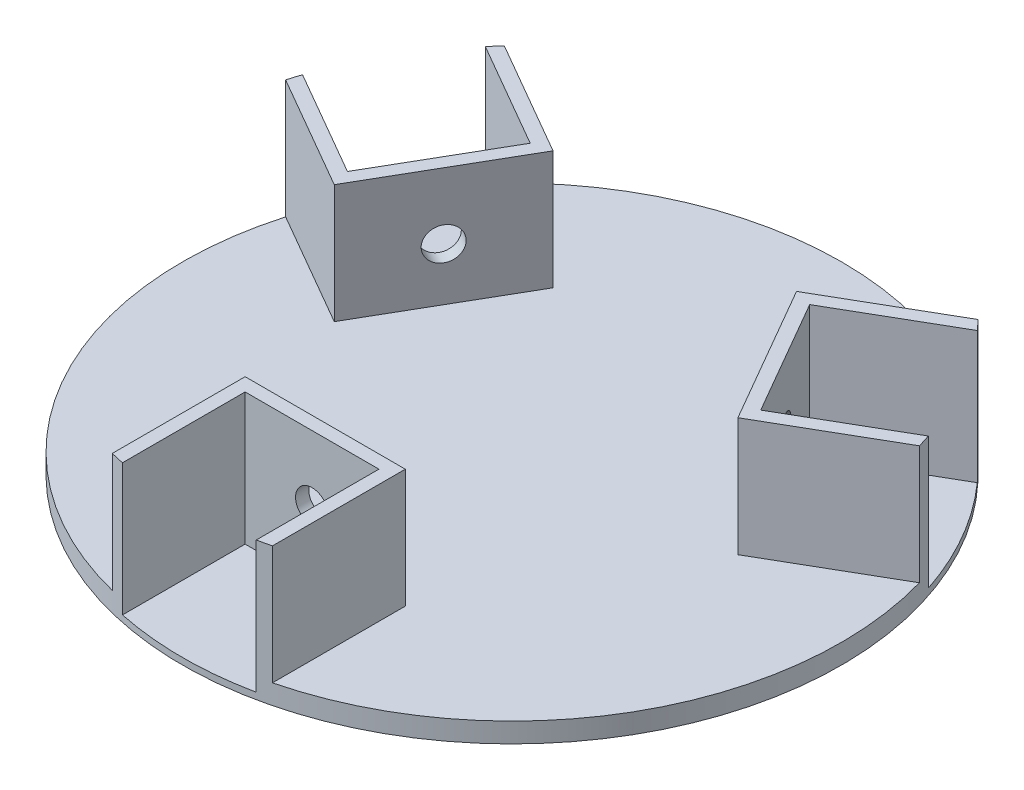
ISO-10303-21;
HEADER;
FILE_DESCRIPTION(('STEP AP214'),'2;1');
FILE_NAME('part.step','',(''),(''),'','','');
FILE_SCHEMA(('AUTOMOTIVE_DESIGN { 1 0 10303 214 1 1 1 1 }'));
ENDSEC;
DATA;
#1=APPLICATION_CONTEXT('core data for automotive mechanical design processes');
#2=APPLICATION_PROTOCOL_DEFINITION('international standard','automotive_design',2000,#1);
#3=PRODUCT_CONTEXT('',#1,'mechanical');
#4=PRODUCT('Part','Part','',(#3));
#5=PRODUCT_RELATED_PRODUCT_CATEGORY('part','',(#4));
#6=PRODUCT_DEFINITION_FORMATION('','',#4);
#7=PRODUCT_DEFINITION_CONTEXT('part definition',#1,'design');
#8=PRODUCT_DEFINITION('design','',#6,#7);
#9=PRODUCT_DEFINITION_SHAPE('','',#8);
#10=(LENGTH_UNIT() NAMED_UNIT(*) SI_UNIT(.MILLI.,.METRE.));
#11=(NAMED_UNIT(*) PLANE_ANGLE_UNIT() SI_UNIT($,.RADIAN.));
#12=(NAMED_UNIT(*) SI_UNIT($,.STERADIAN.) SOLID_ANGLE_UNIT());
#13=UNCERTAINTY_MEASURE_WITH_UNIT(LENGTH_MEASURE(1.E-05),#10,'distance_accuracy_value','');
#14=(GEOMETRIC_REPRESENTATION_CONTEXT(3) GLOBAL_UNCERTAINTY_ASSIGNED_CONTEXT((#13)) GLOBAL_UNIT_ASSIGNED_CONTEXT((#10,
#11,#12)) REPRESENTATION_CONTEXT('',''));
#15=CARTESIAN_POINT('',(0.,0.,0.));
#16=DIRECTION('',(0.,0.,1.));
#17=DIRECTION('',(1.,0.,0.));
#18=AXIS2_PLACEMENT_3D('',#15,#16,#17);
#19=CARTESIAN_POINT('',(0.,20.,240.726435625391));
#20=DIRECTION('',(0.,1.,0.));
#21=DIRECTION('',(0.,0.,1.));
#22=AXIS2_PLACEMENT_3D('',#19,#20,#21);
#23=PLANE('',#22);
#24=DIRECTION('',(0.,0.,-1.));
#25=VECTOR('',#24,1.);
#26=CARTESIAN_POINT('',(-12.1499999999999,20.,271.07041555162));
#27=LINE('',#26,#25);
#28=CARTESIAN_POINT('',(-12.15,20.,289.22775004057));
#29=VERTEX_POINT('',#28);
#30=CARTESIAN_POINT('',(-12.1499999999999,20.,269.07041555162));
#31=VERTEX_POINT('',#30);
#32=EDGE_CURVE('E291',#29,#31,#27,.T.);
#33=ORIENTED_EDGE('',*,*,#32,.F.);
#34=CARTESIAN_POINT('',(0.,20.,240.726435625391));
#35=DIRECTION('',(0.,1.,0.));
#36=DIRECTION('',(0.,0.,1.));
#37=AXIS2_PLACEMENT_3D('',#34,#35,#36);
#38=CIRCLE('',#37,50.);
#39=CARTESIAN_POINT('',(-10.15,20.,289.685372501104));
#40=VERTEX_POINT('',#39);
#41=EDGE_CURVE('E218',#29,#40,#38,.T.);
#42=ORIENTED_EDGE('',*,*,#41,.T.);
#43=DIRECTION('',(0.,0.,-1.));
#44=VECTOR('',#43,1.);
#45=CARTESIAN_POINT('',(-10.1499999999999,20.,271.07041555162));
#46=LINE('',#45,#44);
#47=CARTESIAN_POINT('',(-10.1499999999999,20.,271.07041555162));
#48=VERTEX_POINT('',#47);
#49=EDGE_CURVE('E211',#40,#48,#46,.T.);
#50=ORIENTED_EDGE('',*,*,#49,.T.);
#51=DIRECTION('',(1.,0.,0.));
#52=VECTOR('',#51,1.);
#53=CARTESIAN_POINT('',(10.15,20.,271.07041555162));
#54=LINE('',#53,#52);
#55=CARTESIAN_POINT('',(10.15,20.,271.07041555162));
#56=VERTEX_POINT('',#55);
#57=EDGE_CURVE('E328',#48,#56,#54,.T.);
#58=ORIENTED_EDGE('',*,*,#57,.T.);
#59=DIRECTION('',(0.,0.,1.));
#60=VECTOR('',#59,1.);
#61=CARTESIAN_POINT('',(10.15,20.,271.07041555162));
#62=LINE('',#61,#60);
#63=CARTESIAN_POINT('',(10.1500000000001,20.,289.685372501104));
#64=VERTEX_POINT('',#63);
#65=EDGE_CURVE('E330',#56,#64,#62,.T.);
#66=ORIENTED_EDGE('',*,*,#65,.T.);
#67=CARTESIAN_POINT('',(0.,20.,240.726435625391));
#68=DIRECTION('',(0.,1.,0.));
#69=DIRECTION('',(0.,0.,1.));
#70=AXIS2_PLACEMENT_3D('',#67,#68,#69);
#71=CIRCLE('',#70,50.);
#72=CARTESIAN_POINT('',(12.15,20.,289.22775004057));
#73=VERTEX_POINT('',#72);
#74=EDGE_CURVE('E333',#64,#73,#71,.T.);
#75=ORIENTED_EDGE('',*,*,#74,.T.);
#76=DIRECTION('',(0.,0.,1.));
#77=VECTOR('',#76,1.);
#78=CARTESIAN_POINT('',(12.15,20.,271.07041555162));
#79=LINE('',#78,#77);
#80=CARTESIAN_POINT('',(12.15,20.,269.07041555162));
#81=VERTEX_POINT('',#80);
#82=EDGE_CURVE('E297',#81,#73,#79,.T.);
#83=ORIENTED_EDGE('',*,*,#82,.F.);
#84=DIRECTION('',(1.,0.,0.));
#85=VECTOR('',#84,1.);
#86=CARTESIAN_POINT('',(10.15,20.,269.07041555162));
#87=LINE('',#86,#85);
#88=EDGE_CURVE('E294',#31,#81,#87,.T.);
#89=ORIENTED_EDGE('',*,*,#88,.F.);
#90=EDGE_LOOP('',(#33,#42,#50,#58,#66,#75,#83,#89));
#91=FACE_BOUND('',#90,.T.);
#92=ADVANCED_FACE('F33',(#91),#23,.T.);
#93=DIRECTION('',(-0.866025403784439,0.,0.499999999999999));
#94=VECTOR('',#93,1.);
#95=CARTESIAN_POINT('',(32.3536574680391,20.,236.076654318258));
#96=LINE('',#95,#94);
#97=CARTESIAN_POINT('',(48.0783704004809,20.,226.997987073783));
#98=VERTEX_POINT('',#97);
#99=CARTESIAN_POINT('',(30.6216066604702,20.,237.076654318258));
#100=VERTEX_POINT('',#99);
#101=EDGE_CURVE('E300',#98,#100,#96,.T.);
#102=ORIENTED_EDGE('',*,*,#101,.F.);
#103=CARTESIAN_POINT('',(47.4746830766457,20.,225.037125035947));
#104=VERTEX_POINT('',#103);
#105=EDGE_CURVE('E332',#98,#104,#71,.T.);
#106=ORIENTED_EDGE('',*,*,#105,.T.);
#107=DIRECTION('',(-0.866025403784439,0.,0.499999999999999));
#108=VECTOR('',#107,1.);
#109=CARTESIAN_POINT('',(31.3536574680391,20.,234.344603510689));
#110=LINE('',#109,#108);
#111=CARTESIAN_POINT('',(31.3536574680391,20.,234.344603510689));
#112=VERTEX_POINT('',#111);
#113=EDGE_CURVE('E336',#104,#112,#110,.T.);
#114=ORIENTED_EDGE('',*,*,#113,.T.);
#115=DIRECTION('',(-0.500000000000001,0.,-0.866025403784438));
#116=VECTOR('',#115,1.);
#117=CARTESIAN_POINT('',(21.2036574680391,20.,216.764287813865));
#118=LINE('',#117,#116);
#119=CARTESIAN_POINT('',(21.2036574680391,20.,216.764287813865));
#120=VERTEX_POINT('',#119);
#121=EDGE_CURVE('E338',#112,#120,#118,.T.);
#122=ORIENTED_EDGE('',*,*,#121,.T.);
#123=DIRECTION('',(0.866025403784437,0.,-0.500000000000003));
#124=VECTOR('',#123,1.);
#125=CARTESIAN_POINT('',(21.2036574680391,20.,216.764287813865));
#126=LINE('',#125,#124);
#127=CARTESIAN_POINT('',(37.3246830766457,20.,207.456809339123));
#128=VERTEX_POINT('',#127);
#129=EDGE_CURVE('E129',#120,#128,#126,.T.);
#130=ORIENTED_EDGE('',*,*,#129,.T.);
#131=CARTESIAN_POINT('',(0.,20.,240.726435625391));
#132=DIRECTION('',(0.,1.,0.));
#133=DIRECTION('',(0.,0.,1.));
#134=AXIS2_PLACEMENT_3D('',#131,#132,#133);
#135=CIRCLE('',#134,50.);
#136=CARTESIAN_POINT('',(35.9283704004809,20.,205.953569761821));
#137=VERTEX_POINT('',#136);
#138=EDGE_CURVE('E128',#128,#137,#135,.T.);
#139=ORIENTED_EDGE('',*,*,#138,.T.);
#140=DIRECTION('',(0.866025403784437,0.,-0.500000000000002));
#141=VECTOR('',#140,1.);
#142=CARTESIAN_POINT('',(20.2036574680391,20.,215.032237006296));
#143=LINE('',#142,#141);
#144=CARTESIAN_POINT('',(18.4716066604702,20.,216.032237006296));
#145=VERTEX_POINT('',#144);
#146=EDGE_CURVE('E312',#145,#137,#143,.T.);
#147=ORIENTED_EDGE('',*,*,#146,.F.);
#148=DIRECTION('',(-0.500000000000001,0.,-0.866025403784438));
#149=VECTOR('',#148,1.);
#150=CARTESIAN_POINT('',(19.4716066604702,20.,217.764287813865));
#151=LINE('',#150,#149);
#152=EDGE_CURVE('E309',#100,#145,#151,.T.);
#153=ORIENTED_EDGE('',*,*,#152,.F.);
#154=EDGE_LOOP('',(#102,#106,#114,#122,#130,#139,#147,#153));
#155=FACE_BOUND('',#154,.T.);
#156=ADVANCED_FACE('F343',(#155),#23,.T.);
#157=CARTESIAN_POINT('',(-31.353657468039,20.,234.344603510689));
#158=DIRECTION('',(-0.499999999999998,0.,0.86602540378444));
#159=DIRECTION('',(0.86602540378444,0.,0.499999999999998));
#160=AXIS2_PLACEMENT_3D('',#157,#158,#159);
#161=PLANE('',#160);
#162=DIRECTION('',(-0.86602540378444,0.,-0.499999999999998));
#163=VECTOR('',#162,1.);
#164=CARTESIAN_POINT('',(-31.353657468039,0.,234.344603510689));
#165=LINE('',#164,#163);
#166=CARTESIAN_POINT('',(-31.353657468039,0.,234.344603510689));
#167=VERTEX_POINT('',#166);
#168=CARTESIAN_POINT('',(-47.4746830766456,0.,225.037125035947));
#169=VERTEX_POINT('',#168);
#170=EDGE_CURVE('E156',#167,#169,#165,.T.);
#171=ORIENTED_EDGE('',*,*,#170,.T.);
#172=DIRECTION('',(0.,-1.,0.));
#173=VECTOR('',#172,1.);
#174=CARTESIAN_POINT('',(-47.4746830766457,20.,225.037125035947));
#175=LINE('',#174,#173);
#176=CARTESIAN_POINT('',(-47.4746830766457,20.,225.037125035947));
#177=VERTEX_POINT('',#176);
#178=EDGE_CURVE('E11',#177,#169,#175,.T.);
#179=ORIENTED_EDGE('',*,*,#178,.F.);
#180=DIRECTION('',(-0.86602540378444,0.,-0.499999999999998));
#181=VECTOR('',#180,1.);
#182=CARTESIAN_POINT('',(-31.353657468039,20.,234.344603510689));
#183=LINE('',#182,#181);
#184=CARTESIAN_POINT('',(-31.353657468039,20.,234.344603510689));
#185=VERTEX_POINT('',#184);
#186=EDGE_CURVE('E181',#185,#177,#183,.T.);
#187=ORIENTED_EDGE('',*,*,#186,.F.);
#188=DIRECTION('',(0.,-1.,0.));
#189=VECTOR('',#188,1.);
#190=CARTESIAN_POINT('',(-31.353657468039,20.,234.344603510689));
#191=LINE('',#190,#189);
#192=EDGE_CURVE('E147',#185,#167,#191,.T.);
#193=ORIENTED_EDGE('',*,*,#192,.T.);
#194=EDGE_LOOP('',(#171,#179,#187,#193));
#195=FACE_BOUND('',#194,.T.);
#196=ADVANCED_FACE('F35',(#195),#161,.F.);
#197=CARTESIAN_POINT('',(-10.1499999999999,20.,271.07041555162));
#198=DIRECTION('',(-1.,0.,0.));
#199=DIRECTION('',(0.,0.,1.));
#200=AXIS2_PLACEMENT_3D('',#197,#198,#199);
#201=PLANE('',#200);
#202=DIRECTION('',(0.,0.,-1.));
#203=VECTOR('',#202,1.);
#204=CARTESIAN_POINT('',(-10.1499999999999,0.,271.07041555162));
#205=LINE('',#204,#203);
#206=CARTESIAN_POINT('',(-10.15,0.,289.685372501104));
#207=VERTEX_POINT('',#206);
#208=CARTESIAN_POINT('',(-10.1499999999999,0.,271.07041555162));
#209=VERTEX_POINT('',#208);
#210=EDGE_CURVE('E160',#207,#209,#205,.T.);
#211=ORIENTED_EDGE('',*,*,#210,.T.);
#212=DIRECTION('',(0.,-1.,0.));
#213=VECTOR('',#212,1.);
#214=CARTESIAN_POINT('',(-10.1499999999999,20.,271.07041555162));
#215=LINE('',#214,#213);
#216=EDGE_CURVE('E195',#48,#209,#215,.T.);
#217=ORIENTED_EDGE('',*,*,#216,.F.);
#218=ORIENTED_EDGE('',*,*,#49,.F.);
#219=DIRECTION('',(0.,-1.,0.));
#220=VECTOR('',#219,1.);
#221=CARTESIAN_POINT('',(-10.15,20.,289.685372501104));
#222=LINE('',#221,#220);
#223=EDGE_CURVE('E42',#40,#207,#222,.T.);
#224=ORIENTED_EDGE('',*,*,#223,.T.);
#225=EDGE_LOOP('',(#211,#217,#218,#224));
#226=FACE_BOUND('',#225,.T.);
#227=ADVANCED_FACE('F209',(#226),#201,.F.);
#228=CARTESIAN_POINT('',(10.15,20.,271.07041555162));
#229=DIRECTION('',(0.,0.,-1.));
#230=DIRECTION('',(-1.,0.,0.));
#231=AXIS2_PLACEMENT_3D('',#228,#229,#230);
#232=PLANE('',#231);
#233=CARTESIAN_POINT('',(-2.2576551587395E-12,10.,271.07041555162));
#234=DIRECTION('',(0.,0.,-1.));
#235=DIRECTION('',(-1.,0.,0.));
#236=AXIS2_PLACEMENT_3D('',#233,#234,#235);
#237=CIRCLE('',#236,2.49999999999715);
#238=CARTESIAN_POINT('',(-2.49999999999941,10.,271.07041555162));
#239=VERTEX_POINT('',#238);
#240=EDGE_CURVE('E230',#239,#239,#237,.T.);
#241=ORIENTED_EDGE('',*,*,#240,.T.);
#242=EDGE_LOOP('',(#241));
#243=FACE_BOUND('',#242,.T.);
#244=DIRECTION('',(1.,0.,0.));
#245=VECTOR('',#244,1.);
#246=CARTESIAN_POINT('',(10.15,0.,271.07041555162));
#247=LINE('',#246,#245);
#248=CARTESIAN_POINT('',(10.15,0.,271.07041555162));
#249=VERTEX_POINT('',#248);
#250=EDGE_CURVE('E72',#209,#249,#247,.T.);
#251=ORIENTED_EDGE('',*,*,#250,.T.);
#252=DIRECTION('',(0.,-1.,0.));
#253=VECTOR('',#252,1.);
#254=CARTESIAN_POINT('',(10.15,20.,271.07041555162));
#255=LINE('',#254,#253);
#256=EDGE_CURVE('E192',#56,#249,#255,.T.);
#257=ORIENTED_EDGE('',*,*,#256,.F.);
#258=ORIENTED_EDGE('',*,*,#57,.F.);
#259=ORIENTED_EDGE('',*,*,#216,.T.);
#260=EDGE_LOOP('',(#251,#257,#258,#259));
#261=FACE_BOUND('',#260,.T.);
#262=ADVANCED_FACE('F444',(#243,#261),#232,.F.);
#263=CARTESIAN_POINT('',(10.15,20.,271.07041555162));
#264=DIRECTION('',(1.,0.,0.));
#265=DIRECTION('',(0.,0.,-1.));
#266=AXIS2_PLACEMENT_3D('',#263,#264,#265);
#267=PLANE('',#266);
#268=DIRECTION('',(0.,0.,1.));
#269=VECTOR('',#268,1.);
#270=CARTESIAN_POINT('',(10.15,0.,271.07041555162));
#271=LINE('',#270,#269);
#272=CARTESIAN_POINT('',(10.1500000000001,0.,289.685372501104));
#273=VERTEX_POINT('',#272);
#274=EDGE_CURVE('E439',#249,#273,#271,.T.);
#275=ORIENTED_EDGE('',*,*,#274,.T.);
#276=DIRECTION('',(0.,-1.,0.));
#277=VECTOR('',#276,1.);
#278=CARTESIAN_POINT('',(10.1500000000001,20.,289.685372501104));
#279=LINE('',#278,#277);
#280=EDGE_CURVE('E196',#64,#273,#279,.T.);
#281=ORIENTED_EDGE('',*,*,#280,.F.);
#282=ORIENTED_EDGE('',*,*,#65,.F.);
#283=ORIENTED_EDGE('',*,*,#256,.T.);
#284=EDGE_LOOP('',(#275,#281,#282,#283));
#285=FACE_BOUND('',#284,.T.);
#286=ADVANCED_FACE('F447',(#285),#267,.F.);
#287=CARTESIAN_POINT('',(31.3536574680391,20.,234.344603510689));
#288=DIRECTION('',(0.499999999999999,0.,0.866025403784439));
#289=DIRECTION('',(0.866025403784439,0.,-0.499999999999999));
#290=AXIS2_PLACEMENT_3D('',#287,#288,#289);
#291=PLANE('',#290);
#292=DIRECTION('',(-0.866025403784439,0.,0.499999999999999));
#293=VECTOR('',#292,1.);
#294=CARTESIAN_POINT('',(31.3536574680391,0.,234.344603510689));
#295=LINE('',#294,#293);
#296=CARTESIAN_POINT('',(47.4746830766456,0.,225.037125035947));
#297=VERTEX_POINT('',#296);
#298=CARTESIAN_POINT('',(31.3536574680391,0.,234.344603510689));
#299=VERTEX_POINT('',#298);
#300=EDGE_CURVE('E424',#297,#299,#295,.T.);
#301=ORIENTED_EDGE('',*,*,#300,.T.);
#302=DIRECTION('',(0.,-1.,0.));
#303=VECTOR('',#302,1.);
#304=CARTESIAN_POINT('',(31.3536574680391,20.,234.344603510689));
#305=LINE('',#304,#303);
#306=EDGE_CURVE('E188',#112,#299,#305,.T.);
#307=ORIENTED_EDGE('',*,*,#306,.F.);
#308=ORIENTED_EDGE('',*,*,#113,.F.);
#309=DIRECTION('',(0.,-1.,0.));
#310=VECTOR('',#309,1.);
#311=CARTESIAN_POINT('',(47.4746830766457,20.,225.037125035947));
#312=LINE('',#311,#310);
#313=EDGE_CURVE('E191',#104,#297,#312,.T.);
#314=ORIENTED_EDGE('',*,*,#313,.T.);
#315=EDGE_LOOP('',(#301,#307,#308,#314));
#316=FACE_BOUND('',#315,.T.);
#317=ADVANCED_FACE('F430',(#316),#291,.F.);
#318=CARTESIAN_POINT('',(21.2036574680391,20.,216.764287813865));
#319=DIRECTION('',(-0.866025403784438,0.,0.500000000000001));
#320=DIRECTION('',(0.500000000000001,0.,0.866025403784438));
#321=AXIS2_PLACEMENT_3D('',#318,#319,#320);
#322=PLANE('',#321);
#323=CARTESIAN_POINT('',(26.2786574680403,10.,225.554445662279));
#324=DIRECTION('',(-0.866025403784438,0.,0.500000000000001));
#325=DIRECTION('',(0.500000000000001,0.,0.866025403784438));
#326=AXIS2_PLACEMENT_3D('',#323,#324,#325);
#327=CIRCLE('',#326,2.49999999999715);
#328=CARTESIAN_POINT('',(27.5286574680389,10.,227.719509171738));
#329=VERTEX_POINT('',#328);
#330=EDGE_CURVE('E546',#329,#329,#327,.T.);
#331=ORIENTED_EDGE('',*,*,#330,.T.);
#332=EDGE_LOOP('',(#331));
#333=FACE_BOUND('',#332,.T.);
#334=DIRECTION('',(-0.500000000000001,0.,-0.866025403784438));
#335=VECTOR('',#334,1.);
#336=CARTESIAN_POINT('',(21.2036574680391,0.,216.764287813865));
#337=LINE('',#336,#335);
#338=CARTESIAN_POINT('',(21.2036574680391,0.,216.764287813865));
#339=VERTEX_POINT('',#338);
#340=EDGE_CURVE('E174',#299,#339,#337,.T.);
#341=ORIENTED_EDGE('',*,*,#340,.T.);
#342=DIRECTION('',(0.,-1.,0.));
#343=VECTOR('',#342,1.);
#344=CARTESIAN_POINT('',(21.2036574680391,20.,216.764287813865));
#345=LINE('',#344,#343);
#346=EDGE_CURVE('E185',#120,#339,#345,.T.);
#347=ORIENTED_EDGE('',*,*,#346,.F.);
#348=ORIENTED_EDGE('',*,*,#121,.F.);
#349=ORIENTED_EDGE('',*,*,#306,.T.);
#350=EDGE_LOOP('',(#341,#347,#348,#349));
#351=FACE_BOUND('',#350,.T.);
#352=ADVANCED_FACE('F568',(#333,#351),#322,.F.);
#353=CARTESIAN_POINT('',(21.2036574680391,20.,216.764287813865));
#354=DIRECTION('',(-0.500000000000002,0.,-0.866025403784437));
#355=DIRECTION('',(-0.866025403784437,0.,0.500000000000002));
#356=AXIS2_PLACEMENT_3D('',#353,#354,#355);
#357=PLANE('',#356);
#358=DIRECTION('',(0.866025403784437,0.,-0.500000000000003));
#359=VECTOR('',#358,1.);
#360=CARTESIAN_POINT('',(21.2036574680391,0.,216.764287813865));
#361=LINE('',#360,#359);
#362=CARTESIAN_POINT('',(37.3246830766456,0.,207.456809339123));
#363=VERTEX_POINT('',#362);
#364=EDGE_CURVE('E166',#339,#363,#361,.T.);
#365=ORIENTED_EDGE('',*,*,#364,.T.);
#366=DIRECTION('',(0.,-1.,0.));
#367=VECTOR('',#366,1.);
#368=CARTESIAN_POINT('',(37.3246830766457,20.,207.456809339123));
#369=LINE('',#368,#367);
#370=EDGE_CURVE('E141',#128,#363,#369,.T.);
#371=ORIENTED_EDGE('',*,*,#370,.F.);
#372=ORIENTED_EDGE('',*,*,#129,.F.);
#373=ORIENTED_EDGE('',*,*,#346,.T.);
#374=EDGE_LOOP('',(#365,#371,#372,#373));
#375=FACE_BOUND('',#374,.T.);
#376=ADVANCED_FACE('F350',(#375),#357,.F.);
#377=CARTESIAN_POINT('',(0.,20.,240.726435625391));
#378=DIRECTION('',(0.,-1.,0.));
#379=DIRECTION('',(0.,0.,-1.));
#380=AXIS2_PLACEMENT_3D('',#377,#378,#379);
#381=CYLINDRICAL_SURFACE('',#380,50.);
#382=CARTESIAN_POINT('',(-35.9283704004809,20.,205.953569761821));
#383=VERTEX_POINT('',#382);
#384=CARTESIAN_POINT('',(-37.3246830766457,20.,207.456809339123));
#385=VERTEX_POINT('',#384);
#386=EDGE_CURVE('E118',#383,#385,#135,.T.);
#387=ORIENTED_EDGE('',*,*,#386,.F.);
#388=DIRECTION('',(0.,-1.,0.));
#389=VECTOR('',#388,1.);
#390=CARTESIAN_POINT('',(-35.9283704004809,20.,205.953569761821));
#391=LINE('',#390,#389);
#392=CARTESIAN_POINT('',(-35.9283704004809,2.,205.953569761821));
#393=VERTEX_POINT('',#392);
#394=EDGE_CURVE('E247',#383,#393,#391,.T.);
#395=ORIENTED_EDGE('',*,*,#394,.T.);
#396=CARTESIAN_POINT('',(0.,2.,240.726435625391));
#397=DIRECTION('',(0.,1.,0.));
#398=DIRECTION('',(0.,0.,1.));
#399=AXIS2_PLACEMENT_3D('',#396,#397,#398);
#400=CIRCLE('',#399,50.);
#401=CARTESIAN_POINT('',(35.9283704004809,2.,205.953569761821));
#402=VERTEX_POINT('',#401);
#403=EDGE_CURVE('E250',#402,#393,#400,.T.);
#404=ORIENTED_EDGE('',*,*,#403,.F.);
#405=DIRECTION('',(0.,-1.,0.));
#406=VECTOR('',#405,1.);
#407=CARTESIAN_POINT('',(35.9283704004809,20.,205.953569761821));
#408=LINE('',#407,#406);
#409=EDGE_CURVE('E285',#137,#402,#408,.T.);
#410=ORIENTED_EDGE('',*,*,#409,.F.);
#411=ORIENTED_EDGE('',*,*,#138,.F.);
#412=ORIENTED_EDGE('',*,*,#370,.T.);
#413=CARTESIAN_POINT('',(0.,0.,240.726435625391));
#414=DIRECTION('',(0.,-1.,0.));
#415=DIRECTION('',(0.,0.,-1.));
#416=AXIS2_PLACEMENT_3D('',#413,#414,#415);
#417=CIRCLE('',#416,49.9999999999998);
#418=EDGE_CURVE('E225',#363,#297,#417,.T.);
#419=ORIENTED_EDGE('',*,*,#418,.T.);
#420=ORIENTED_EDGE('',*,*,#313,.F.);
#421=ORIENTED_EDGE('',*,*,#105,.F.);
#422=DIRECTION('',(0.,-1.,0.));
#423=VECTOR('',#422,1.);
#424=CARTESIAN_POINT('',(48.0783704004809,20.,226.997987073783));
#425=LINE('',#424,#423);
#426=CARTESIAN_POINT('',(48.0783704004809,2.,226.997987073783));
#427=VERTEX_POINT('',#426);
#428=EDGE_CURVE('E281',#98,#427,#425,.T.);
#429=ORIENTED_EDGE('',*,*,#428,.T.);
#430=CARTESIAN_POINT('',(0.,2.,240.726435625391));
#431=DIRECTION('',(0.,1.,0.));
#432=DIRECTION('',(0.,0.,1.));
#433=AXIS2_PLACEMENT_3D('',#430,#431,#432);
#434=CIRCLE('',#433,50.);
#435=CARTESIAN_POINT('',(12.15,2.,289.22775004057));
#436=VERTEX_POINT('',#435);
#437=EDGE_CURVE('E260',#436,#427,#434,.T.);
#438=ORIENTED_EDGE('',*,*,#437,.F.);
#439=DIRECTION('',(0.,-1.,0.));
#440=VECTOR('',#439,1.);
#441=CARTESIAN_POINT('',(12.15,20.,289.22775004057));
#442=LINE('',#441,#440);
#443=EDGE_CURVE('E277',#73,#436,#442,.T.);
#444=ORIENTED_EDGE('',*,*,#443,.F.);
#445=ORIENTED_EDGE('',*,*,#74,.F.);
#446=ORIENTED_EDGE('',*,*,#280,.T.);
#447=EDGE_CURVE('E221',#273,#207,#417,.T.);
#448=ORIENTED_EDGE('',*,*,#447,.T.);
#449=ORIENTED_EDGE('',*,*,#223,.F.);
#450=ORIENTED_EDGE('',*,*,#41,.F.);
#451=DIRECTION('',(0.,-1.,0.));
#452=VECTOR('',#451,1.);
#453=CARTESIAN_POINT('',(-12.15,20.,289.22775004057));
#454=LINE('',#453,#452);
#455=CARTESIAN_POINT('',(-12.15,2.,289.22775004057));
#456=VERTEX_POINT('',#455);
#457=EDGE_CURVE('E273',#29,#456,#454,.T.);
#458=ORIENTED_EDGE('',*,*,#457,.T.);
#459=CARTESIAN_POINT('',(0.,2.,240.726435625391));
#460=DIRECTION('',(0.,1.,0.));
#461=DIRECTION('',(0.,0.,1.));
#462=AXIS2_PLACEMENT_3D('',#459,#460,#461);
#463=CIRCLE('',#462,50.);
#464=CARTESIAN_POINT('',(-48.0783704004809,2.,226.997987073783));
#465=VERTEX_POINT('',#464);
#466=EDGE_CURVE('E238',#465,#456,#463,.T.);
#467=ORIENTED_EDGE('',*,*,#466,.F.);
#468=DIRECTION('',(0.,-1.,0.));
#469=VECTOR('',#468,1.);
#470=CARTESIAN_POINT('',(-48.0783704004809,20.,226.997987073783));
#471=LINE('',#470,#469);
#472=CARTESIAN_POINT('',(-48.0783704004809,20.,226.997987073783));
#473=VERTEX_POINT('',#472);
#474=EDGE_CURVE('E161',#473,#465,#471,.T.);
#475=ORIENTED_EDGE('',*,*,#474,.F.);
#476=EDGE_CURVE('E324',#177,#473,#38,.T.);
#477=ORIENTED_EDGE('',*,*,#476,.F.);
#478=ORIENTED_EDGE('',*,*,#178,.T.);
#479=CARTESIAN_POINT('',(-37.3246830766456,0.,207.456809339123));
#480=VERTEX_POINT('',#479);
#481=EDGE_CURVE('E138',#169,#480,#417,.T.);
#482=ORIENTED_EDGE('',*,*,#481,.T.);
#483=DIRECTION('',(0.,-1.,0.));
#484=VECTOR('',#483,1.);
#485=CARTESIAN_POINT('',(-37.3246830766457,20.,207.456809339123));
#486=LINE('',#485,#484);
#487=EDGE_CURVE('E133',#385,#480,#486,.T.);
#488=ORIENTED_EDGE('',*,*,#487,.F.);
#489=EDGE_LOOP('',(#387,#395,#404,#410,#411,#412,#419,#420,#421,#429,#438,#444,#445,#446,#448,
#449,#450,#458,#467,#475,#477,#478,#482,#488));
#490=FACE_BOUND('',#489,.T.);
#491=CARTESIAN_POINT('',(0.,-1.,240.726435625391));
#492=DIRECTION('',(0.,-1.,0.));
#493=DIRECTION('',(0.,0.,-1.));
#494=AXIS2_PLACEMENT_3D('',#491,#492,#493);
#495=CIRCLE('',#494,49.9999999999998);
#496=CARTESIAN_POINT('',(0.,-1.,190.726435625392));
#497=VERTEX_POINT('',#496);
#498=EDGE_CURVE('E228',#497,#497,#495,.T.);
#499=ORIENTED_EDGE('',*,*,#498,.F.);
#500=EDGE_LOOP('',(#499));
#501=FACE_BOUND('',#500,.T.);
#502=ADVANCED_FACE('F134',(#490,#501),#381,.T.);
#503=CARTESIAN_POINT('',(-21.2036574680391,20.,216.764287813865));
#504=DIRECTION('',(0.500000000000002,0.,-0.866025403784438));
#505=DIRECTION('',(-0.866025403784438,0.,-0.500000000000002));
#506=AXIS2_PLACEMENT_3D('',#503,#504,#505);
#507=PLANE('',#506);
#508=DIRECTION('',(0.866025403784437,0.,0.500000000000002));
#509=VECTOR('',#508,1.);
#510=CARTESIAN_POINT('',(-21.2036574680391,0.,216.764287813865));
#511=LINE('',#510,#509);
#512=CARTESIAN_POINT('',(-21.2036574680391,0.,216.764287813865));
#513=VERTEX_POINT('',#512);
#514=EDGE_CURVE('E163',#480,#513,#511,.T.);
#515=ORIENTED_EDGE('',*,*,#514,.T.);
#516=DIRECTION('',(0.,-1.,0.));
#517=VECTOR('',#516,1.);
#518=CARTESIAN_POINT('',(-21.2036574680391,20.,216.764287813865));
#519=LINE('',#518,#517);
#520=CARTESIAN_POINT('',(-21.2036574680391,20.,216.764287813865));
#521=VERTEX_POINT('',#520);
#522=EDGE_CURVE('E142',#521,#513,#519,.T.);
#523=ORIENTED_EDGE('',*,*,#522,.F.);
#524=DIRECTION('',(0.866025403784437,0.,0.500000000000002));
#525=VECTOR('',#524,1.);
#526=CARTESIAN_POINT('',(-21.2036574680391,20.,216.764287813865));
#527=LINE('',#526,#525);
#528=EDGE_CURVE('E123',#385,#521,#527,.T.);
#529=ORIENTED_EDGE('',*,*,#528,.F.);
#530=ORIENTED_EDGE('',*,*,#487,.T.);
#531=EDGE_LOOP('',(#515,#523,#529,#530));
#532=FACE_BOUND('',#531,.T.);
#533=ADVANCED_FACE('F144',(#532),#507,.F.);
#534=CARTESIAN_POINT('',(-31.353657468039,20.,234.344603510689));
#535=DIRECTION('',(0.866025403784439,0.,0.5));
#536=DIRECTION('',(0.5,0.,-0.866025403784439));
#537=AXIS2_PLACEMENT_3D('',#534,#535,#536);
#538=PLANE('',#537);
#539=CARTESIAN_POINT('',(-26.2786574680379,10.,225.554445662275));
#540=DIRECTION('',(0.866025403784439,0.,0.5));
#541=DIRECTION('',(0.5,0.,-0.866025403784439));
#542=AXIS2_PLACEMENT_3D('',#539,#540,#541);
#543=CIRCLE('',#542,2.49999999999715);
#544=CARTESIAN_POINT('',(-25.0286574680393,10.,223.389382152816));
#545=VERTEX_POINT('',#544);
#546=EDGE_CURVE('E551',#545,#545,#543,.T.);
#547=ORIENTED_EDGE('',*,*,#546,.T.);
#548=EDGE_LOOP('',(#547));
#549=FACE_BOUND('',#548,.T.);
#550=DIRECTION('',(-0.5,0.,0.866025403784439));
#551=VECTOR('',#550,1.);
#552=CARTESIAN_POINT('',(-31.353657468039,0.,234.344603510689));
#553=LINE('',#552,#551);
#554=EDGE_CURVE('E165',#513,#167,#553,.T.);
#555=ORIENTED_EDGE('',*,*,#554,.T.);
#556=ORIENTED_EDGE('',*,*,#192,.F.);
#557=DIRECTION('',(-0.5,0.,0.866025403784439));
#558=VECTOR('',#557,1.);
#559=CARTESIAN_POINT('',(-31.353657468039,20.,234.344603510689));
#560=LINE('',#559,#558);
#561=EDGE_CURVE('E59',#521,#185,#560,.T.);
#562=ORIENTED_EDGE('',*,*,#561,.F.);
#563=ORIENTED_EDGE('',*,*,#522,.T.);
#564=EDGE_LOOP('',(#555,#556,#562,#563));
#565=FACE_BOUND('',#564,.T.);
#566=ADVANCED_FACE('F472',(#549,#565),#538,.F.);
#567=DIRECTION('',(-0.86602540378444,0.,-0.499999999999998));
#568=VECTOR('',#567,1.);
#569=CARTESIAN_POINT('',(-32.353657468039,20.,236.076654318258));
#570=LINE('',#569,#568);
#571=CARTESIAN_POINT('',(-30.6216066604701,20.,237.076654318258));
#572=VERTEX_POINT('',#571);
#573=EDGE_CURVE('E244',#572,#473,#570,.T.);
#574=ORIENTED_EDGE('',*,*,#573,.F.);
#575=DIRECTION('',(-0.5,0.,0.866025403784439));
#576=VECTOR('',#575,1.);
#577=CARTESIAN_POINT('',(-29.6216066604701,20.,235.344603510689));
#578=LINE('',#577,#576);
#579=CARTESIAN_POINT('',(-18.4716066604702,20.,216.032237006296));
#580=VERTEX_POINT('',#579);
#581=EDGE_CURVE('E81',#580,#572,#578,.T.);
#582=ORIENTED_EDGE('',*,*,#581,.F.);
#583=DIRECTION('',(0.866025403784438,0.,0.500000000000002));
#584=VECTOR('',#583,1.);
#585=CARTESIAN_POINT('',(-20.203657468039,20.,215.032237006296));
#586=LINE('',#585,#584);
#587=EDGE_CURVE('E125',#383,#580,#586,.T.);
#588=ORIENTED_EDGE('',*,*,#587,.F.);
#589=ORIENTED_EDGE('',*,*,#386,.T.);
#590=ORIENTED_EDGE('',*,*,#528,.T.);
#591=ORIENTED_EDGE('',*,*,#561,.T.);
#592=ORIENTED_EDGE('',*,*,#186,.T.);
#593=ORIENTED_EDGE('',*,*,#476,.T.);
#594=EDGE_LOOP('',(#574,#582,#588,#589,#590,#591,#592,#593));
#595=FACE_BOUND('',#594,.T.);
#596=ADVANCED_FACE('F121',(#595),#23,.T.);
#597=CARTESIAN_POINT('',(-32.353657468039,20.,236.076654318258));
#598=DIRECTION('',(-0.499999999999998,0.,0.86602540378444));
#599=DIRECTION('',(0.86602540378444,0.,0.499999999999998));
#600=AXIS2_PLACEMENT_3D('',#597,#598,#599);
#601=PLANE('',#600);
#602=DIRECTION('',(-0.86602540378444,0.,-0.499999999999998));
#603=VECTOR('',#602,1.);
#604=CARTESIAN_POINT('',(-32.353657468039,2.,236.076654318258));
#605=LINE('',#604,#603);
#606=CARTESIAN_POINT('',(-30.6216066604701,2.,237.076654318258));
#607=VERTEX_POINT('',#606);
#608=EDGE_CURVE('E235',#607,#465,#605,.T.);
#609=ORIENTED_EDGE('',*,*,#608,.F.);
#610=DIRECTION('',(0.,-1.,0.));
#611=VECTOR('',#610,1.);
#612=CARTESIAN_POINT('',(-30.6216066604701,20.,237.076654318258));
#613=LINE('',#612,#611);
#614=EDGE_CURVE('E239',#572,#607,#613,.T.);
#615=ORIENTED_EDGE('',*,*,#614,.F.);
#616=ORIENTED_EDGE('',*,*,#573,.T.);
#617=ORIENTED_EDGE('',*,*,#474,.T.);
#618=EDGE_LOOP('',(#609,#615,#616,#617));
#619=FACE_BOUND('',#618,.T.);
#620=ADVANCED_FACE('F480',(#619),#601,.T.);
#621=CARTESIAN_POINT('',(-12.1499999999999,20.,271.07041555162));
#622=DIRECTION('',(-1.,0.,0.));
#623=DIRECTION('',(0.,0.,1.));
#624=AXIS2_PLACEMENT_3D('',#621,#622,#623);
#625=PLANE('',#624);
#626=DIRECTION('',(0.,0.,-1.));
#627=VECTOR('',#626,1.);
#628=CARTESIAN_POINT('',(-12.1499999999999,2.,271.07041555162));
#629=LINE('',#628,#627);
#630=CARTESIAN_POINT('',(-12.1499999999999,2.,269.07041555162));
#631=VERTEX_POINT('',#630);
#632=EDGE_CURVE('E267',#456,#631,#629,.T.);
#633=ORIENTED_EDGE('',*,*,#632,.F.);
#634=ORIENTED_EDGE('',*,*,#457,.F.);
#635=ORIENTED_EDGE('',*,*,#32,.T.);
#636=DIRECTION('',(0.,-1.,0.));
#637=VECTOR('',#636,1.);
#638=CARTESIAN_POINT('',(-12.1499999999999,20.,269.07041555162));
#639=LINE('',#638,#637);
#640=EDGE_CURVE('E270',#31,#631,#639,.T.);
#641=ORIENTED_EDGE('',*,*,#640,.T.);
#642=EDGE_LOOP('',(#633,#634,#635,#641));
#643=FACE_BOUND('',#642,.T.);
#644=ADVANCED_FACE('F455',(#643),#625,.T.);
#645=CARTESIAN_POINT('',(10.15,20.,269.07041555162));
#646=DIRECTION('',(0.,0.,-1.));
#647=DIRECTION('',(-1.,0.,0.));
#648=AXIS2_PLACEMENT_3D('',#645,#646,#647);
#649=PLANE('',#648);
#650=CARTESIAN_POINT('',(-2.24100181337012E-12,10.,269.07041555162));
#651=DIRECTION('',(0.,0.,-1.));
#652=DIRECTION('',(-1.,0.,0.));
#653=AXIS2_PLACEMENT_3D('',#650,#651,#652);
#654=CIRCLE('',#653,2.49999999999715);
#655=CARTESIAN_POINT('',(-2.4999999999994,10.,269.07041555162));
#656=VERTEX_POINT('',#655);
#657=EDGE_CURVE('E556',#656,#656,#654,.T.);
#658=ORIENTED_EDGE('',*,*,#657,.F.);
#659=EDGE_LOOP('',(#658));
#660=FACE_BOUND('',#659,.T.);
#661=DIRECTION('',(1.,0.,0.));
#662=VECTOR('',#661,1.);
#663=CARTESIAN_POINT('',(10.15,2.,269.07041555162));
#664=LINE('',#663,#662);
#665=CARTESIAN_POINT('',(12.15,2.,269.07041555162));
#666=VERTEX_POINT('',#665);
#667=EDGE_CURVE('E264',#631,#666,#664,.T.);
#668=ORIENTED_EDGE('',*,*,#667,.F.);
#669=ORIENTED_EDGE('',*,*,#640,.F.);
#670=ORIENTED_EDGE('',*,*,#88,.T.);
#671=DIRECTION('',(0.,-1.,0.));
#672=VECTOR('',#671,1.);
#673=CARTESIAN_POINT('',(12.15,20.,269.07041555162));
#674=LINE('',#673,#672);
#675=EDGE_CURVE('E274',#81,#666,#674,.T.);
#676=ORIENTED_EDGE('',*,*,#675,.T.);
#677=EDGE_LOOP('',(#668,#669,#670,#676));
#678=FACE_BOUND('',#677,.T.);
#679=ADVANCED_FACE('F458',(#660,#678),#649,.T.);
#680=CARTESIAN_POINT('',(12.15,20.,271.07041555162));
#681=DIRECTION('',(1.,0.,0.));
#682=DIRECTION('',(0.,0.,-1.));
#683=AXIS2_PLACEMENT_3D('',#680,#681,#682);
#684=PLANE('',#683);
#685=DIRECTION('',(0.,0.,1.));
#686=VECTOR('',#685,1.);
#687=CARTESIAN_POINT('',(12.15,2.,271.07041555162));
#688=LINE('',#687,#686);
#689=EDGE_CURVE('E261',#666,#436,#688,.T.);
#690=ORIENTED_EDGE('',*,*,#689,.F.);
#691=ORIENTED_EDGE('',*,*,#675,.F.);
#692=ORIENTED_EDGE('',*,*,#82,.T.);
#693=ORIENTED_EDGE('',*,*,#443,.T.);
#694=EDGE_LOOP('',(#690,#691,#692,#693));
#695=FACE_BOUND('',#694,.T.);
#696=ADVANCED_FACE('F508',(#695),#684,.T.);
#697=CARTESIAN_POINT('',(32.3536574680391,20.,236.076654318258));
#698=DIRECTION('',(0.499999999999999,0.,0.866025403784439));
#699=DIRECTION('',(0.866025403784439,0.,-0.499999999999999));
#700=AXIS2_PLACEMENT_3D('',#697,#698,#699);
#701=PLANE('',#700);
#702=DIRECTION('',(-0.866025403784439,0.,0.499999999999999));
#703=VECTOR('',#702,1.);
#704=CARTESIAN_POINT('',(32.3536574680391,2.,236.076654318258));
#705=LINE('',#704,#703);
#706=CARTESIAN_POINT('',(30.6216066604702,2.,237.076654318258));
#707=VERTEX_POINT('',#706);
#708=EDGE_CURVE('E257',#427,#707,#705,.T.);
#709=ORIENTED_EDGE('',*,*,#708,.F.);
#710=ORIENTED_EDGE('',*,*,#428,.F.);
#711=ORIENTED_EDGE('',*,*,#101,.T.);
#712=DIRECTION('',(0.,-1.,0.));
#713=VECTOR('',#712,1.);
#714=CARTESIAN_POINT('',(30.6216066604702,20.,237.076654318258));
#715=LINE('',#714,#713);
#716=EDGE_CURVE('E278',#100,#707,#715,.T.);
#717=ORIENTED_EDGE('',*,*,#716,.T.);
#718=EDGE_LOOP('',(#709,#710,#711,#717));
#719=FACE_BOUND('',#718,.T.);
#720=ADVANCED_FACE('F504',(#719),#701,.T.);
#721=CARTESIAN_POINT('',(19.4716066604702,20.,217.764287813865));
#722=DIRECTION('',(-0.866025403784438,0.,0.500000000000001));
#723=DIRECTION('',(0.500000000000001,0.,0.866025403784438));
#724=AXIS2_PLACEMENT_3D('',#721,#722,#723);
#725=PLANE('',#724);
#726=CARTESIAN_POINT('',(24.5466066604714,10.,226.554445662279));
#727=DIRECTION('',(-0.866025403784447,0.,0.499999999999985));
#728=DIRECTION('',(0.499999999999985,0.,0.866025403784447));
#729=AXIS2_PLACEMENT_3D('',#726,#727,#728);
#730=CIRCLE('',#729,2.49999999999715);
#731=CARTESIAN_POINT('',(25.7966066604699,10.,228.719509171738));
#732=VERTEX_POINT('',#731);
#733=EDGE_CURVE('E543',#732,#732,#730,.T.);
#734=ORIENTED_EDGE('',*,*,#733,.F.);
#735=EDGE_LOOP('',(#734));
#736=FACE_BOUND('',#735,.T.);
#737=DIRECTION('',(-0.500000000000001,0.,-0.866025403784438));
#738=VECTOR('',#737,1.);
#739=CARTESIAN_POINT('',(19.4716066604702,2.,217.764287813865));
#740=LINE('',#739,#738);
#741=CARTESIAN_POINT('',(18.4716066604702,2.,216.032237006296));
#742=VERTEX_POINT('',#741);
#743=EDGE_CURVE('E254',#707,#742,#740,.T.);
#744=ORIENTED_EDGE('',*,*,#743,.F.);
#745=ORIENTED_EDGE('',*,*,#716,.F.);
#746=ORIENTED_EDGE('',*,*,#152,.T.);
#747=DIRECTION('',(0.,-1.,0.));
#748=VECTOR('',#747,1.);
#749=CARTESIAN_POINT('',(18.4716066604702,20.,216.032237006296));
#750=LINE('',#749,#748);
#751=EDGE_CURVE('E282',#145,#742,#750,.T.);
#752=ORIENTED_EDGE('',*,*,#751,.T.);
#753=EDGE_LOOP('',(#744,#745,#746,#752));
#754=FACE_BOUND('',#753,.T.);
#755=ADVANCED_FACE('F501',(#736,#754),#725,.T.);
#756=CARTESIAN_POINT('',(20.2036574680391,20.,215.032237006296));
#757=DIRECTION('',(-0.500000000000002,0.,-0.866025403784437));
#758=DIRECTION('',(-0.866025403784437,0.,0.500000000000002));
#759=AXIS2_PLACEMENT_3D('',#756,#757,#758);
#760=PLANE('',#759);
#761=DIRECTION('',(0.866025403784437,0.,-0.500000000000002));
#762=VECTOR('',#761,1.);
#763=CARTESIAN_POINT('',(20.2036574680391,2.,215.032237006296));
#764=LINE('',#763,#762);
#765=EDGE_CURVE('E251',#742,#402,#764,.T.);
#766=ORIENTED_EDGE('',*,*,#765,.F.);
#767=ORIENTED_EDGE('',*,*,#751,.F.);
#768=ORIENTED_EDGE('',*,*,#146,.T.);
#769=ORIENTED_EDGE('',*,*,#409,.T.);
#770=EDGE_LOOP('',(#766,#767,#768,#769));
#771=FACE_BOUND('',#770,.T.);
#772=ADVANCED_FACE('F360',(#771),#760,.T.);
#773=CARTESIAN_POINT('',(-20.203657468039,20.,215.032237006296));
#774=DIRECTION('',(0.500000000000002,0.,-0.866025403784438));
#775=DIRECTION('',(-0.866025403784438,0.,-0.500000000000002));
#776=AXIS2_PLACEMENT_3D('',#773,#774,#775);
#777=PLANE('',#776);
#778=DIRECTION('',(0.866025403784438,0.,0.500000000000002));
#779=VECTOR('',#778,1.);
#780=CARTESIAN_POINT('',(-20.203657468039,2.,215.032237006296));
#781=LINE('',#780,#779);
#782=CARTESIAN_POINT('',(-18.4716066604702,2.,216.032237006296));
#783=VERTEX_POINT('',#782);
#784=EDGE_CURVE('E245',#393,#783,#781,.T.);
#785=ORIENTED_EDGE('',*,*,#784,.F.);
#786=ORIENTED_EDGE('',*,*,#394,.F.);
#787=ORIENTED_EDGE('',*,*,#587,.T.);
#788=DIRECTION('',(0.,-1.,0.));
#789=VECTOR('',#788,1.);
#790=CARTESIAN_POINT('',(-18.4716066604702,20.,216.032237006296));
#791=LINE('',#790,#789);
#792=EDGE_CURVE('E50',#580,#783,#791,.T.);
#793=ORIENTED_EDGE('',*,*,#792,.T.);
#794=EDGE_LOOP('',(#785,#786,#787,#793));
#795=FACE_BOUND('',#794,.T.);
#796=ADVANCED_FACE('F494',(#795),#777,.T.);
#797=CARTESIAN_POINT('',(-29.6216066604701,20.,235.344603510689));
#798=DIRECTION('',(0.866025403784439,0.,0.5));
#799=DIRECTION('',(0.5,0.,-0.866025403784439));
#800=AXIS2_PLACEMENT_3D('',#797,#798,#799);
#801=PLANE('',#800);
#802=CARTESIAN_POINT('',(-24.546606660469,10.,226.554445662275));
#803=DIRECTION('',(0.866025403784432,0.,0.500000000000011));
#804=DIRECTION('',(0.500000000000011,0.,-0.866025403784432));
#805=AXIS2_PLACEMENT_3D('',#802,#803,#804);
#806=CIRCLE('',#805,2.49999999999715);
#807=CARTESIAN_POINT('',(-23.2966066604704,10.,224.389382152816));
#808=VERTEX_POINT('',#807);
#809=EDGE_CURVE('E548',#808,#808,#806,.T.);
#810=ORIENTED_EDGE('',*,*,#809,.F.);
#811=EDGE_LOOP('',(#810));
#812=FACE_BOUND('',#811,.T.);
#813=DIRECTION('',(-0.5,0.,0.866025403784439));
#814=VECTOR('',#813,1.);
#815=CARTESIAN_POINT('',(-29.6216066604701,2.,235.344603510689));
#816=LINE('',#815,#814);
#817=EDGE_CURVE('E241',#783,#607,#816,.T.);
#818=ORIENTED_EDGE('',*,*,#817,.F.);
#819=ORIENTED_EDGE('',*,*,#792,.F.);
#820=ORIENTED_EDGE('',*,*,#581,.T.);
#821=ORIENTED_EDGE('',*,*,#614,.T.);
#822=EDGE_LOOP('',(#818,#819,#820,#821));
#823=FACE_BOUND('',#822,.T.);
#824=ADVANCED_FACE('F491',(#812,#823),#801,.T.);
#825=CARTESIAN_POINT('',(0.,2.,240.726435625391));
#826=DIRECTION('',(0.,1.,0.));
#827=DIRECTION('',(0.,0.,1.));
#828=AXIS2_PLACEMENT_3D('',#825,#826,#827);
#829=PLANE('',#828);
#830=ORIENTED_EDGE('',*,*,#608,.T.);
#831=ORIENTED_EDGE('',*,*,#466,.T.);
#832=ORIENTED_EDGE('',*,*,#632,.T.);
#833=ORIENTED_EDGE('',*,*,#667,.T.);
#834=ORIENTED_EDGE('',*,*,#689,.T.);
#835=ORIENTED_EDGE('',*,*,#437,.T.);
#836=ORIENTED_EDGE('',*,*,#708,.T.);
#837=ORIENTED_EDGE('',*,*,#743,.T.);
#838=ORIENTED_EDGE('',*,*,#765,.T.);
#839=ORIENTED_EDGE('',*,*,#403,.T.);
#840=ORIENTED_EDGE('',*,*,#784,.T.);
#841=ORIENTED_EDGE('',*,*,#817,.T.);
#842=EDGE_LOOP('',(#830,#831,#832,#833,#834,#835,#836,#837,#838,#839,#840,#841));
#843=FACE_BOUND('',#842,.T.);
#844=ADVANCED_FACE('F461',(#843),#829,.T.);
#845=CARTESIAN_POINT('',(0.,0.,240.726435625391));
#846=DIRECTION('',(0.,-1.,0.));
#847=DIRECTION('',(0.,0.,-1.));
#848=AXIS2_PLACEMENT_3D('',#845,#846,#847);
#849=PLANE('',#848);
#850=ORIENTED_EDGE('',*,*,#170,.F.);
#851=ORIENTED_EDGE('',*,*,#554,.F.);
#852=ORIENTED_EDGE('',*,*,#514,.F.);
#853=ORIENTED_EDGE('',*,*,#481,.F.);
#854=EDGE_LOOP('',(#850,#851,#852,#853));
#855=FACE_BOUND('',#854,.T.);
#856=ADVANCED_FACE('F470',(#855),#849,.F.);
#857=ORIENTED_EDGE('',*,*,#364,.F.);
#858=ORIENTED_EDGE('',*,*,#340,.F.);
#859=ORIENTED_EDGE('',*,*,#300,.F.);
#860=ORIENTED_EDGE('',*,*,#418,.F.);
#861=EDGE_LOOP('',(#857,#858,#859,#860));
#862=FACE_BOUND('',#861,.T.);
#863=ADVANCED_FACE('F421',(#862),#849,.F.);
#864=CARTESIAN_POINT('',(0.,-1.,240.726435625391));
#865=DIRECTION('',(0.,-1.,0.));
#866=DIRECTION('',(0.,0.,-1.));
#867=AXIS2_PLACEMENT_3D('',#864,#865,#866);
#868=PLANE('',#867);
#869=ORIENTED_EDGE('',*,*,#498,.T.);
#870=EDGE_LOOP('',(#869));
#871=FACE_BOUND('',#870,.T.);
#872=ADVANCED_FACE('F524',(#871),#868,.T.);
#873=ORIENTED_EDGE('',*,*,#274,.F.);
#874=ORIENTED_EDGE('',*,*,#250,.F.);
#875=ORIENTED_EDGE('',*,*,#210,.F.);
#876=ORIENTED_EDGE('',*,*,#447,.F.);
#877=EDGE_LOOP('',(#873,#874,#875,#876));
#878=FACE_BOUND('',#877,.T.);
#879=ADVANCED_FACE('F520',(#878),#849,.F.);
#880=CARTESIAN_POINT('',(-2.42132461234428E-12,10.,290.726460625392));
#881=DIRECTION('',(0.,0.,-1.));
#882=DIRECTION('',(-1.,0.,0.));
#883=AXIS2_PLACEMENT_3D('',#880,#881,#882);
#884=CYLINDRICAL_SURFACE('',#883,2.49999999999715);
#885=ORIENTED_EDGE('',*,*,#657,.T.);
#886=EDGE_LOOP('',(#885));
#887=FACE_BOUND('',#886,.T.);
#888=ORIENTED_EDGE('',*,*,#240,.F.);
#889=EDGE_LOOP('',(#888));
#890=FACE_BOUND('',#889,.T.);
#891=ADVANCED_FACE('F523',(#887,#890),#884,.F.);
#892=CARTESIAN_POINT('',(-59.1506350946097,10.,206.575800530778));
#893=DIRECTION('',(0.866025403784432,0.,0.500000000000011));
#894=DIRECTION('',(0.500000000000011,0.,-0.866025403784432));
#895=AXIS2_PLACEMENT_3D('',#892,#893,#894);
#896=CYLINDRICAL_SURFACE('',#895,2.49999999999715);
#897=ORIENTED_EDGE('',*,*,#809,.T.);
#898=EDGE_LOOP('',(#897));
#899=FACE_BOUND('',#898,.T.);
#900=ORIENTED_EDGE('',*,*,#546,.F.);
#901=EDGE_LOOP('',(#900));
#902=FACE_BOUND('',#901,.T.);
#903=ADVANCED_FACE('F530',(#899,#902),#896,.F.);
#904=CARTESIAN_POINT('',(59.1506350946123,10.,206.575800530783));
#905=DIRECTION('',(-0.866025403784447,0.,0.499999999999985));
#906=DIRECTION('',(0.499999999999985,0.,0.866025403784448));
#907=AXIS2_PLACEMENT_3D('',#904,#905,#906);
#908=CYLINDRICAL_SURFACE('',#907,2.49999999999715);
#909=ORIENTED_EDGE('',*,*,#733,.T.);
#910=EDGE_LOOP('',(#909));
#911=FACE_BOUND('',#910,.T.);
#912=ORIENTED_EDGE('',*,*,#330,.F.);
#913=EDGE_LOOP('',(#912));
#914=FACE_BOUND('',#913,.T.);
#915=ADVANCED_FACE('F534',(#911,#914),#908,.F.);
#916=CLOSED_SHELL('',(#92,#156,#196,#227,#262,#286,#317,#352,#376,#502,#533,#566,#596,#620,#644,
#679,#696,#720,#755,#772,#796,#824,#844,#856,#863,#872,#879,#891,#903,#915));
#917=MANIFOLD_SOLID_BREP('B2',#916);
#918=ADVANCED_BREP_SHAPE_REPRESENTATION('',(#18,#917),#14);
#919=SHAPE_DEFINITION_REPRESENTATION(#9,#918);
ENDSEC;
END-ISO-10303-21;
